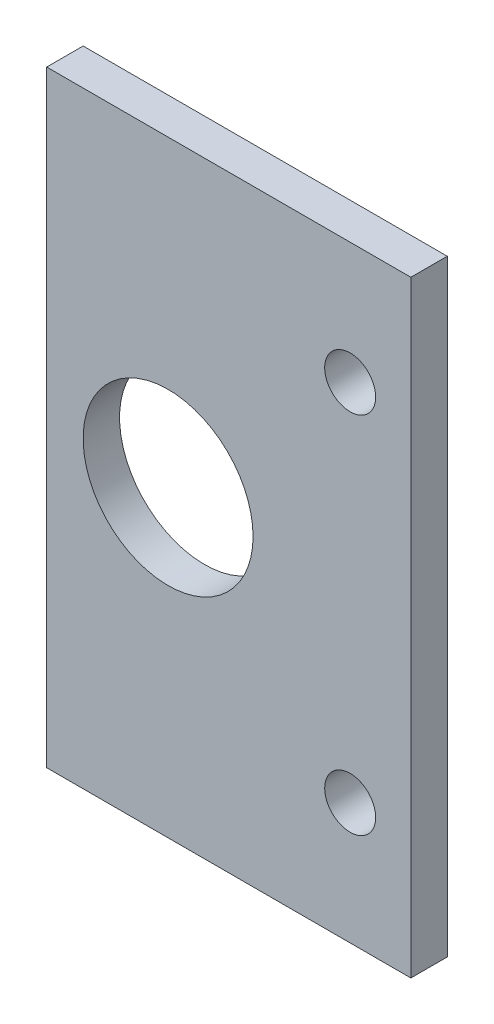
ISO-10303-21;
HEADER;
FILE_DESCRIPTION(('STEP AP214'),'2;1');
FILE_NAME('part.step','',(''),(''),'','','');
FILE_SCHEMA(('AUTOMOTIVE_DESIGN { 1 0 10303 214 1 1 1 1 }'));
ENDSEC;
DATA;
#1=APPLICATION_CONTEXT('core data for automotive mechanical design processes');
#2=APPLICATION_PROTOCOL_DEFINITION('international standard','automotive_design',2000,#1);
#3=PRODUCT_CONTEXT('',#1,'mechanical');
#4=PRODUCT('Part','Part','',(#3));
#5=PRODUCT_RELATED_PRODUCT_CATEGORY('part','',(#4));
#6=PRODUCT_DEFINITION_FORMATION('','',#4);
#7=PRODUCT_DEFINITION_CONTEXT('part definition',#1,'design');
#8=PRODUCT_DEFINITION('design','',#6,#7);
#9=PRODUCT_DEFINITION_SHAPE('','',#8);
#10=(LENGTH_UNIT() NAMED_UNIT(*) SI_UNIT(.MILLI.,.METRE.));
#11=(NAMED_UNIT(*) PLANE_ANGLE_UNIT() SI_UNIT($,.RADIAN.));
#12=(NAMED_UNIT(*) SI_UNIT($,.STERADIAN.) SOLID_ANGLE_UNIT());
#13=UNCERTAINTY_MEASURE_WITH_UNIT(LENGTH_MEASURE(1.E-05),#10,'distance_accuracy_value','');
#14=(GEOMETRIC_REPRESENTATION_CONTEXT(3) GLOBAL_UNCERTAINTY_ASSIGNED_CONTEXT((#13)) GLOBAL_UNIT_ASSIGNED_CONTEXT((#10,
#11,#12)) REPRESENTATION_CONTEXT('',''));
#15=CARTESIAN_POINT('',(0.,0.,0.));
#16=DIRECTION('',(0.,0.,1.));
#17=DIRECTION('',(1.,0.,0.));
#18=AXIS2_PLACEMENT_3D('',#15,#16,#17);
#19=CARTESIAN_POINT('',(0.,0.,3.));
#20=DIRECTION('',(1.,0.,0.));
#21=DIRECTION('',(0.,1.,0.));
#22=AXIS2_PLACEMENT_3D('',#19,#20,#21);
#23=PLANE('',#22);
#24=DIRECTION('',(0.,-1.,0.));
#25=VECTOR('',#24,1.);
#26=CARTESIAN_POINT('',(0.,0.,0.));
#27=LINE('',#26,#25);
#28=CARTESIAN_POINT('',(0.,0.,0.));
#29=VERTEX_POINT('',#28);
#30=CARTESIAN_POINT('',(0.,-50.,0.));
#31=VERTEX_POINT('',#30);
#32=EDGE_CURVE('E112',#29,#31,#27,.T.);
#33=ORIENTED_EDGE('',*,*,#32,.T.);
#34=DIRECTION('',(0.,0.,-1.));
#35=VECTOR('',#34,1.);
#36=CARTESIAN_POINT('',(0.,-50.,3.));
#37=LINE('',#36,#35);
#38=CARTESIAN_POINT('',(0.,-50.,3.));
#39=VERTEX_POINT('',#38);
#40=EDGE_CURVE('E11',#39,#31,#37,.T.);
#41=ORIENTED_EDGE('',*,*,#40,.F.);
#42=DIRECTION('',(0.,-1.,0.));
#43=VECTOR('',#42,1.);
#44=CARTESIAN_POINT('',(0.,0.,3.));
#45=LINE('',#44,#43);
#46=CARTESIAN_POINT('',(0.,0.,3.));
#47=VERTEX_POINT('',#46);
#48=EDGE_CURVE('E96',#47,#39,#45,.T.);
#49=ORIENTED_EDGE('',*,*,#48,.F.);
#50=DIRECTION('',(0.,0.,-1.));
#51=VECTOR('',#50,1.);
#52=CARTESIAN_POINT('',(0.,0.,3.));
#53=LINE('',#52,#51);
#54=EDGE_CURVE('E108',#47,#29,#53,.T.);
#55=ORIENTED_EDGE('',*,*,#54,.T.);
#56=EDGE_LOOP('',(#33,#41,#49,#55));
#57=FACE_BOUND('',#56,.T.);
#58=ADVANCED_FACE('F44',(#57),#23,.F.);
#59=CARTESIAN_POINT('',(0.,-50.,3.));
#60=DIRECTION('',(0.,1.,0.));
#61=DIRECTION('',(0.,0.,1.));
#62=AXIS2_PLACEMENT_3D('',#59,#60,#61);
#63=PLANE('',#62);
#64=DIRECTION('',(1.,0.,0.));
#65=VECTOR('',#64,1.);
#66=CARTESIAN_POINT('',(0.,-50.,0.));
#67=LINE('',#66,#65);
#68=CARTESIAN_POINT('',(30.,-50.,0.));
#69=VERTEX_POINT('',#68);
#70=EDGE_CURVE('E101',#31,#69,#67,.T.);
#71=ORIENTED_EDGE('',*,*,#70,.T.);
#72=DIRECTION('',(0.,0.,-1.));
#73=VECTOR('',#72,1.);
#74=CARTESIAN_POINT('',(30.,-50.,3.));
#75=LINE('',#74,#73);
#76=CARTESIAN_POINT('',(30.,-50.,3.));
#77=VERTEX_POINT('',#76);
#78=EDGE_CURVE('E53',#77,#69,#75,.T.);
#79=ORIENTED_EDGE('',*,*,#78,.F.);
#80=DIRECTION('',(1.,0.,0.));
#81=VECTOR('',#80,1.);
#82=CARTESIAN_POINT('',(0.,-50.,3.));
#83=LINE('',#82,#81);
#84=EDGE_CURVE('E91',#39,#77,#83,.T.);
#85=ORIENTED_EDGE('',*,*,#84,.F.);
#86=ORIENTED_EDGE('',*,*,#40,.T.);
#87=EDGE_LOOP('',(#71,#79,#85,#86));
#88=FACE_BOUND('',#87,.T.);
#89=ADVANCED_FACE('F100',(#88),#63,.F.);
#90=CARTESIAN_POINT('',(30.,0.,3.));
#91=DIRECTION('',(-1.,0.,0.));
#92=DIRECTION('',(0.,-1.,0.));
#93=AXIS2_PLACEMENT_3D('',#90,#91,#92);
#94=PLANE('',#93);
#95=DIRECTION('',(0.,1.,0.));
#96=VECTOR('',#95,1.);
#97=CARTESIAN_POINT('',(30.,0.,0.));
#98=LINE('',#97,#96);
#99=CARTESIAN_POINT('',(30.,0.,0.));
#100=VERTEX_POINT('',#99);
#101=EDGE_CURVE('E78',#69,#100,#98,.T.);
#102=ORIENTED_EDGE('',*,*,#101,.T.);
#103=DIRECTION('',(0.,0.,-1.));
#104=VECTOR('',#103,1.);
#105=CARTESIAN_POINT('',(30.,0.,3.));
#106=LINE('',#105,#104);
#107=CARTESIAN_POINT('',(30.,0.,3.));
#108=VERTEX_POINT('',#107);
#109=EDGE_CURVE('E103',#108,#100,#106,.T.);
#110=ORIENTED_EDGE('',*,*,#109,.F.);
#111=DIRECTION('',(0.,1.,0.));
#112=VECTOR('',#111,1.);
#113=CARTESIAN_POINT('',(30.,0.,3.));
#114=LINE('',#113,#112);
#115=EDGE_CURVE('E94',#77,#108,#114,.T.);
#116=ORIENTED_EDGE('',*,*,#115,.F.);
#117=ORIENTED_EDGE('',*,*,#78,.T.);
#118=EDGE_LOOP('',(#102,#110,#116,#117));
#119=FACE_BOUND('',#118,.T.);
#120=ADVANCED_FACE('F104',(#119),#94,.F.);
#121=CARTESIAN_POINT('',(0.,0.,3.));
#122=DIRECTION('',(0.,-1.,0.));
#123=DIRECTION('',(0.,0.,-1.));
#124=AXIS2_PLACEMENT_3D('',#121,#122,#123);
#125=PLANE('',#124);
#126=DIRECTION('',(-1.,0.,0.));
#127=VECTOR('',#126,1.);
#128=CARTESIAN_POINT('',(0.,0.,0.));
#129=LINE('',#128,#127);
#130=EDGE_CURVE('E84',#100,#29,#129,.T.);
#131=ORIENTED_EDGE('',*,*,#130,.T.);
#132=ORIENTED_EDGE('',*,*,#54,.F.);
#133=DIRECTION('',(-1.,0.,0.));
#134=VECTOR('',#133,1.);
#135=CARTESIAN_POINT('',(0.,0.,3.));
#136=LINE('',#135,#134);
#137=EDGE_CURVE('E61',#108,#47,#136,.T.);
#138=ORIENTED_EDGE('',*,*,#137,.F.);
#139=ORIENTED_EDGE('',*,*,#109,.T.);
#140=EDGE_LOOP('',(#131,#132,#138,#139));
#141=FACE_BOUND('',#140,.T.);
#142=ADVANCED_FACE('F126',(#141),#125,.F.);
#143=CARTESIAN_POINT('',(0.,0.,3.));
#144=DIRECTION('',(0.,0.,1.));
#145=DIRECTION('',(1.,0.,0.));
#146=AXIS2_PLACEMENT_3D('',#143,#144,#145);
#147=PLANE('',#146);
#148=CARTESIAN_POINT('',(10.,-25.,3.));
#149=DIRECTION('',(0.,0.,1.));
#150=DIRECTION('',(1.,0.,0.));
#151=AXIS2_PLACEMENT_3D('',#148,#149,#150);
#152=CIRCLE('',#151,7.);
#153=CARTESIAN_POINT('',(17.,-25.,3.));
#154=VERTEX_POINT('',#153);
#155=EDGE_CURVE('E149',#154,#154,#152,.T.);
#156=ORIENTED_EDGE('',*,*,#155,.F.);
#157=EDGE_LOOP('',(#156));
#158=FACE_BOUND('',#157,.T.);
#159=CARTESIAN_POINT('',(25.,-10.,3.));
#160=DIRECTION('',(0.,0.,1.));
#161=DIRECTION('',(1.,0.,0.));
#162=AXIS2_PLACEMENT_3D('',#159,#160,#161);
#163=CIRCLE('',#162,2.1);
#164=CARTESIAN_POINT('',(27.1,-10.,3.));
#165=VERTEX_POINT('',#164);
#166=EDGE_CURVE('E145',#165,#165,#163,.T.);
#167=ORIENTED_EDGE('',*,*,#166,.F.);
#168=EDGE_LOOP('',(#167));
#169=FACE_BOUND('',#168,.T.);
#170=CARTESIAN_POINT('',(25.,-40.,3.));
#171=DIRECTION('',(0.,0.,1.));
#172=DIRECTION('',(-1.,0.,0.));
#173=AXIS2_PLACEMENT_3D('',#170,#171,#172);
#174=CIRCLE('',#173,2.1);
#175=CARTESIAN_POINT('',(22.9,-40.,3.));
#176=VERTEX_POINT('',#175);
#177=EDGE_CURVE('E137',#176,#176,#174,.T.);
#178=ORIENTED_EDGE('',*,*,#177,.F.);
#179=EDGE_LOOP('',(#178));
#180=FACE_BOUND('',#179,.T.);
#181=ORIENTED_EDGE('',*,*,#48,.T.);
#182=ORIENTED_EDGE('',*,*,#84,.T.);
#183=ORIENTED_EDGE('',*,*,#115,.T.);
#184=ORIENTED_EDGE('',*,*,#137,.T.);
#185=EDGE_LOOP('',(#181,#182,#183,#184));
#186=FACE_BOUND('',#185,.T.);
#187=ADVANCED_FACE('F92',(#158,#169,#180,#186),#147,.T.);
#188=CARTESIAN_POINT('',(0.,0.,0.));
#189=DIRECTION('',(0.,0.,1.));
#190=DIRECTION('',(1.,0.,0.));
#191=AXIS2_PLACEMENT_3D('',#188,#189,#190);
#192=PLANE('',#191);
#193=CARTESIAN_POINT('',(10.,-25.,0.));
#194=DIRECTION('',(0.,0.,1.));
#195=DIRECTION('',(1.,0.,0.));
#196=AXIS2_PLACEMENT_3D('',#193,#194,#195);
#197=CIRCLE('',#196,7.);
#198=CARTESIAN_POINT('',(17.,-25.,0.));
#199=VERTEX_POINT('',#198);
#200=EDGE_CURVE('E116',#199,#199,#197,.T.);
#201=ORIENTED_EDGE('',*,*,#200,.T.);
#202=EDGE_LOOP('',(#201));
#203=FACE_BOUND('',#202,.T.);
#204=CARTESIAN_POINT('',(25.,-10.,0.));
#205=DIRECTION('',(0.,0.,1.));
#206=DIRECTION('',(1.,0.,0.));
#207=AXIS2_PLACEMENT_3D('',#204,#205,#206);
#208=CIRCLE('',#207,2.1);
#209=CARTESIAN_POINT('',(27.1,-10.,0.));
#210=VERTEX_POINT('',#209);
#211=EDGE_CURVE('E141',#210,#210,#208,.T.);
#212=ORIENTED_EDGE('',*,*,#211,.T.);
#213=EDGE_LOOP('',(#212));
#214=FACE_BOUND('',#213,.T.);
#215=CARTESIAN_POINT('',(25.,-40.,0.));
#216=DIRECTION('',(0.,0.,1.));
#217=DIRECTION('',(-1.,0.,0.));
#218=AXIS2_PLACEMENT_3D('',#215,#216,#217);
#219=CIRCLE('',#218,2.1);
#220=CARTESIAN_POINT('',(22.9,-40.,0.));
#221=VERTEX_POINT('',#220);
#222=EDGE_CURVE('E133',#221,#221,#219,.T.);
#223=ORIENTED_EDGE('',*,*,#222,.T.);
#224=EDGE_LOOP('',(#223));
#225=FACE_BOUND('',#224,.T.);
#226=ORIENTED_EDGE('',*,*,#32,.F.);
#227=ORIENTED_EDGE('',*,*,#130,.F.);
#228=ORIENTED_EDGE('',*,*,#101,.F.);
#229=ORIENTED_EDGE('',*,*,#70,.F.);
#230=EDGE_LOOP('',(#226,#227,#228,#229));
#231=FACE_BOUND('',#230,.T.);
#232=ADVANCED_FACE('F129',(#203,#214,#225,#231),#192,.F.);
#233=CARTESIAN_POINT('',(25.,-40.,0.));
#234=DIRECTION('',(0.,0.,1.));
#235=DIRECTION('',(1.,0.,0.));
#236=AXIS2_PLACEMENT_3D('',#233,#234,#235);
#237=CYLINDRICAL_SURFACE('',#236,2.1);
#238=ORIENTED_EDGE('',*,*,#222,.F.);
#239=EDGE_LOOP('',(#238));
#240=FACE_BOUND('',#239,.T.);
#241=ORIENTED_EDGE('',*,*,#177,.T.);
#242=EDGE_LOOP('',(#241));
#243=FACE_BOUND('',#242,.T.);
#244=ADVANCED_FACE('F173',(#240,#243),#237,.F.);
#245=CARTESIAN_POINT('',(25.,-10.,0.));
#246=DIRECTION('',(0.,0.,1.));
#247=DIRECTION('',(1.,0.,0.));
#248=AXIS2_PLACEMENT_3D('',#245,#246,#247);
#249=CYLINDRICAL_SURFACE('',#248,2.1);
#250=ORIENTED_EDGE('',*,*,#211,.F.);
#251=EDGE_LOOP('',(#250));
#252=FACE_BOUND('',#251,.T.);
#253=ORIENTED_EDGE('',*,*,#166,.T.);
#254=EDGE_LOOP('',(#253));
#255=FACE_BOUND('',#254,.T.);
#256=ADVANCED_FACE('F162',(#252,#255),#249,.F.);
#257=CARTESIAN_POINT('',(10.,-25.,0.));
#258=DIRECTION('',(0.,0.,1.));
#259=DIRECTION('',(1.,0.,0.));
#260=AXIS2_PLACEMENT_3D('',#257,#258,#259);
#261=CYLINDRICAL_SURFACE('',#260,7.);
#262=ORIENTED_EDGE('',*,*,#200,.F.);
#263=EDGE_LOOP('',(#262));
#264=FACE_BOUND('',#263,.T.);
#265=ORIENTED_EDGE('',*,*,#155,.T.);
#266=EDGE_LOOP('',(#265));
#267=FACE_BOUND('',#266,.T.);
#268=ADVANCED_FACE('F159',(#264,#267),#261,.F.);
#269=CLOSED_SHELL('',(#58,#89,#120,#142,#187,#232,#244,#256,#268));
#270=MANIFOLD_SOLID_BREP('B2',#269);
#271=ADVANCED_BREP_SHAPE_REPRESENTATION('',(#18,#270),#14);
#272=SHAPE_DEFINITION_REPRESENTATION(#9,#271);
ENDSEC;
END-ISO-10303-21;
